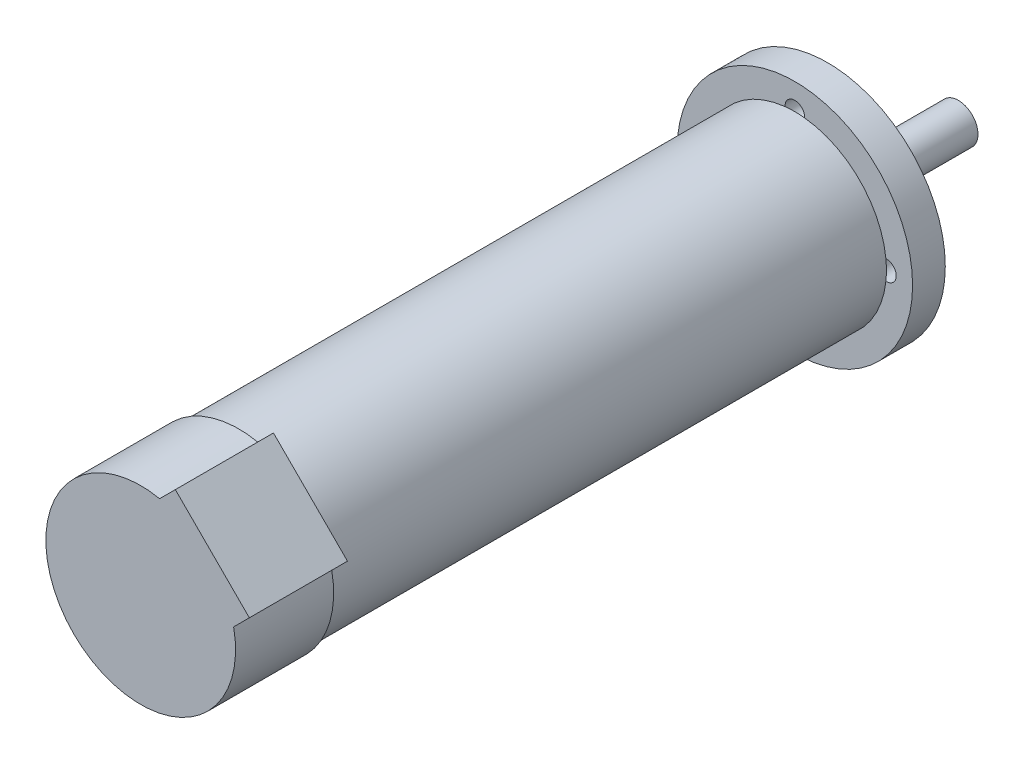
ISO-10303-21;
HEADER;
FILE_DESCRIPTION(('STEP AP214'),'2;1');
FILE_NAME('part.step','',(''),(''),'','','');
FILE_SCHEMA(('AUTOMOTIVE_DESIGN { 1 0 10303 214 1 1 1 1 }'));
ENDSEC;
DATA;
#1=APPLICATION_CONTEXT('core data for automotive mechanical design processes');
#2=APPLICATION_PROTOCOL_DEFINITION('international standard','automotive_design',2000,#1);
#3=PRODUCT_CONTEXT('',#1,'mechanical');
#4=PRODUCT('Part','Part','',(#3));
#5=PRODUCT_RELATED_PRODUCT_CATEGORY('part','',(#4));
#6=PRODUCT_DEFINITION_FORMATION('','',#4);
#7=PRODUCT_DEFINITION_CONTEXT('part definition',#1,'design');
#8=PRODUCT_DEFINITION('design','',#6,#7);
#9=PRODUCT_DEFINITION_SHAPE('','',#8);
#10=(LENGTH_UNIT() NAMED_UNIT(*) SI_UNIT(.MILLI.,.METRE.));
#11=(NAMED_UNIT(*) PLANE_ANGLE_UNIT() SI_UNIT($,.RADIAN.));
#12=(NAMED_UNIT(*) SI_UNIT($,.STERADIAN.) SOLID_ANGLE_UNIT());
#13=UNCERTAINTY_MEASURE_WITH_UNIT(LENGTH_MEASURE(1.E-05),#10,'distance_accuracy_value','');
#14=(GEOMETRIC_REPRESENTATION_CONTEXT(3) GLOBAL_UNCERTAINTY_ASSIGNED_CONTEXT((#13)) GLOBAL_UNIT_ASSIGNED_CONTEXT((#10,
#11,#12)) REPRESENTATION_CONTEXT('',''));
#15=CARTESIAN_POINT('',(0.,0.,0.));
#16=DIRECTION('',(0.,0.,1.));
#17=DIRECTION('',(1.,0.,0.));
#18=AXIS2_PLACEMENT_3D('',#15,#16,#17);
#19=CARTESIAN_POINT('',(0.,0.,105.));
#20=DIRECTION('',(0.,0.,-1.));
#21=DIRECTION('',(-1.,0.,0.));
#22=AXIS2_PLACEMENT_3D('',#19,#20,#21);
#23=CYLINDRICAL_SURFACE('',#22,14.);
#24=CARTESIAN_POINT('',(0.,0.,5.));
#25=DIRECTION('',(0.,0.,1.));
#26=DIRECTION('',(1.,0.,0.));
#27=AXIS2_PLACEMENT_3D('',#24,#25,#26);
#28=CIRCLE('',#27,14.);
#29=CARTESIAN_POINT('',(1.4978460300017,13.9196428571429,5.));
#30=VERTEX_POINT('',#29);
#31=CARTESIAN_POINT('',(-1.4978460300017,13.9196428571429,5.));
#32=VERTEX_POINT('',#31);
#33=EDGE_CURVE('E122',#30,#32,#28,.T.);
#34=ORIENTED_EDGE('',*,*,#33,.T.);
#35=CARTESIAN_POINT('',(-13.9196428571429,1.4978460300017,5.));
#36=VERTEX_POINT('',#35);
#37=EDGE_CURVE('E130',#32,#36,#28,.T.);
#38=ORIENTED_EDGE('',*,*,#37,.T.);
#39=CARTESIAN_POINT('',(-13.9196428571429,-1.49784603000169,5.));
#40=VERTEX_POINT('',#39);
#41=EDGE_CURVE('E294',#36,#40,#28,.T.);
#42=ORIENTED_EDGE('',*,*,#41,.T.);
#43=CARTESIAN_POINT('',(-1.4978460300017,-13.9196428571429,5.));
#44=VERTEX_POINT('',#43);
#45=EDGE_CURVE('E290',#40,#44,#28,.T.);
#46=ORIENTED_EDGE('',*,*,#45,.T.);
#47=CARTESIAN_POINT('',(1.49784603000169,-13.9196428571429,5.));
#48=VERTEX_POINT('',#47);
#49=EDGE_CURVE('E126',#44,#48,#28,.T.);
#50=ORIENTED_EDGE('',*,*,#49,.T.);
#51=CARTESIAN_POINT('',(13.9196428571429,-1.4978460300017,5.));
#52=VERTEX_POINT('',#51);
#53=EDGE_CURVE('E125',#48,#52,#28,.T.);
#54=ORIENTED_EDGE('',*,*,#53,.T.);
#55=CARTESIAN_POINT('',(13.9196428571429,1.49784603000169,5.));
#56=VERTEX_POINT('',#55);
#57=EDGE_CURVE('E108',#52,#56,#28,.T.);
#58=ORIENTED_EDGE('',*,*,#57,.T.);
#59=EDGE_CURVE('E111',#56,#30,#28,.T.);
#60=ORIENTED_EDGE('',*,*,#59,.T.);
#61=EDGE_LOOP('',(#34,#38,#42,#46,#50,#54,#58,#60));
#62=FACE_BOUND('',#61,.T.);
#63=CARTESIAN_POINT('',(0.,0.,90.));
#64=DIRECTION('',(0.,0.,1.));
#65=DIRECTION('',(1.,0.,0.));
#66=AXIS2_PLACEMENT_3D('',#63,#64,#65);
#67=CIRCLE('',#66,14.);
#68=CARTESIAN_POINT('',(14.,0.,90.));
#69=VERTEX_POINT('',#68);
#70=EDGE_CURVE('E42',#69,#69,#67,.T.);
#71=ORIENTED_EDGE('',*,*,#70,.F.);
#72=EDGE_LOOP('',(#71));
#73=FACE_BOUND('',#72,.T.);
#74=ADVANCED_FACE('F34',(#62,#73),#23,.T.);
#75=CARTESIAN_POINT('',(0.,0.,5.));
#76=DIRECTION('',(0.,0.,-1.));
#77=DIRECTION('',(-1.,0.,0.));
#78=AXIS2_PLACEMENT_3D('',#75,#76,#77);
#79=CYLINDRICAL_SURFACE('',#78,18.);
#80=CARTESIAN_POINT('',(0.,0.,5.));
#81=DIRECTION('',(0.,0.,1.));
#82=DIRECTION('',(1.,0.,0.));
#83=AXIS2_PLACEMENT_3D('',#80,#81,#82);
#84=CIRCLE('',#83,18.);
#85=CARTESIAN_POINT('',(18.,0.,5.));
#86=VERTEX_POINT('',#85);
#87=EDGE_CURVE('E133',#86,#86,#84,.T.);
#88=ORIENTED_EDGE('',*,*,#87,.F.);
#89=EDGE_LOOP('',(#88));
#90=FACE_BOUND('',#89,.T.);
#91=CARTESIAN_POINT('',(0.,0.,0.));
#92=DIRECTION('',(0.,0.,1.));
#93=DIRECTION('',(1.,0.,0.));
#94=AXIS2_PLACEMENT_3D('',#91,#92,#93);
#95=CIRCLE('',#94,18.);
#96=CARTESIAN_POINT('',(18.,0.,0.));
#97=VERTEX_POINT('',#96);
#98=EDGE_CURVE('E129',#97,#97,#95,.T.);
#99=ORIENTED_EDGE('',*,*,#98,.T.);
#100=EDGE_LOOP('',(#99));
#101=FACE_BOUND('',#100,.T.);
#102=ADVANCED_FACE('F36',(#90,#101),#79,.T.);
#103=CARTESIAN_POINT('',(0.,0.,5.));
#104=DIRECTION('',(0.,0.,1.));
#105=DIRECTION('',(1.,0.,0.));
#106=AXIS2_PLACEMENT_3D('',#103,#104,#105);
#107=PLANE('',#106);
#108=CARTESIAN_POINT('',(-14.,0.,5.));
#109=DIRECTION('',(0.,0.,1.));
#110=DIRECTION('',(1.,0.,0.));
#111=AXIS2_PLACEMENT_3D('',#108,#109,#110);
#112=CIRCLE('',#111,1.5);
#113=EDGE_CURVE('E181',#40,#36,#112,.F.);
#114=ORIENTED_EDGE('',*,*,#113,.T.);
#115=ORIENTED_EDGE('',*,*,#37,.F.);
#116=CARTESIAN_POINT('',(0.,14.,5.));
#117=DIRECTION('',(0.,0.,1.));
#118=DIRECTION('',(1.,0.,0.));
#119=AXIS2_PLACEMENT_3D('',#116,#117,#118);
#120=CIRCLE('',#119,1.5);
#121=EDGE_CURVE('E116',#32,#30,#120,.F.);
#122=ORIENTED_EDGE('',*,*,#121,.T.);
#123=ORIENTED_EDGE('',*,*,#59,.F.);
#124=CARTESIAN_POINT('',(14.,0.,5.));
#125=DIRECTION('',(0.,0.,1.));
#126=DIRECTION('',(1.,0.,0.));
#127=AXIS2_PLACEMENT_3D('',#124,#125,#126);
#128=CIRCLE('',#127,1.5);
#129=EDGE_CURVE('E97',#56,#52,#128,.F.);
#130=ORIENTED_EDGE('',*,*,#129,.T.);
#131=ORIENTED_EDGE('',*,*,#53,.F.);
#132=CARTESIAN_POINT('',(0.,-14.,5.));
#133=DIRECTION('',(0.,0.,1.));
#134=DIRECTION('',(1.,0.,0.));
#135=AXIS2_PLACEMENT_3D('',#132,#133,#134);
#136=CIRCLE('',#135,1.5);
#137=EDGE_CURVE('E286',#48,#44,#136,.F.);
#138=ORIENTED_EDGE('',*,*,#137,.T.);
#139=ORIENTED_EDGE('',*,*,#45,.F.);
#140=EDGE_LOOP('',(#114,#115,#122,#123,#130,#131,#138,#139));
#141=FACE_BOUND('',#140,.T.);
#142=ORIENTED_EDGE('',*,*,#87,.T.);
#143=EDGE_LOOP('',(#142));
#144=FACE_BOUND('',#143,.T.);
#145=ADVANCED_FACE('F113',(#141,#144),#107,.T.);
#146=CARTESIAN_POINT('',(0.,0.,0.));
#147=DIRECTION('',(0.,0.,1.));
#148=DIRECTION('',(1.,0.,0.));
#149=AXIS2_PLACEMENT_3D('',#146,#147,#148);
#150=PLANE('',#149);
#151=CARTESIAN_POINT('',(0.,0.,0.));
#152=DIRECTION('',(0.,0.,1.));
#153=DIRECTION('',(1.,0.,0.));
#154=AXIS2_PLACEMENT_3D('',#151,#152,#153);
#155=CIRCLE('',#154,3.);
#156=CARTESIAN_POINT('',(3.,0.,0.));
#157=VERTEX_POINT('',#156);
#158=EDGE_CURVE('E11',#157,#157,#155,.F.);
#159=ORIENTED_EDGE('',*,*,#158,.F.);
#160=EDGE_LOOP('',(#159));
#161=FACE_BOUND('',#160,.T.);
#162=CARTESIAN_POINT('',(-14.,0.,0.));
#163=DIRECTION('',(0.,0.,-1.));
#164=DIRECTION('',(-1.,0.,0.));
#165=AXIS2_PLACEMENT_3D('',#162,#163,#164);
#166=CIRCLE('',#165,1.5);
#167=CARTESIAN_POINT('',(-15.5,0.,0.));
#168=VERTEX_POINT('',#167);
#169=EDGE_CURVE('E167',#168,#168,#166,.T.);
#170=ORIENTED_EDGE('',*,*,#169,.F.);
#171=EDGE_LOOP('',(#170));
#172=FACE_BOUND('',#171,.T.);
#173=CARTESIAN_POINT('',(0.,-14.,0.));
#174=DIRECTION('',(0.,0.,-1.));
#175=DIRECTION('',(-1.,0.,0.));
#176=AXIS2_PLACEMENT_3D('',#173,#174,#175);
#177=CIRCLE('',#176,1.5);
#178=CARTESIAN_POINT('',(-1.5,-14.,0.));
#179=VERTEX_POINT('',#178);
#180=EDGE_CURVE('E109',#179,#179,#177,.T.);
#181=ORIENTED_EDGE('',*,*,#180,.F.);
#182=EDGE_LOOP('',(#181));
#183=FACE_BOUND('',#182,.T.);
#184=CARTESIAN_POINT('',(14.,0.,0.));
#185=DIRECTION('',(0.,0.,-1.));
#186=DIRECTION('',(-1.,0.,0.));
#187=AXIS2_PLACEMENT_3D('',#184,#185,#186);
#188=CIRCLE('',#187,1.5);
#189=CARTESIAN_POINT('',(12.5,0.,0.));
#190=VERTEX_POINT('',#189);
#191=EDGE_CURVE('E103',#190,#190,#188,.T.);
#192=ORIENTED_EDGE('',*,*,#191,.F.);
#193=EDGE_LOOP('',(#192));
#194=FACE_BOUND('',#193,.T.);
#195=CARTESIAN_POINT('',(0.,14.,0.));
#196=DIRECTION('',(0.,0.,-1.));
#197=DIRECTION('',(-1.,0.,0.));
#198=AXIS2_PLACEMENT_3D('',#195,#196,#197);
#199=CIRCLE('',#198,1.5);
#200=CARTESIAN_POINT('',(-1.5,14.,0.));
#201=VERTEX_POINT('',#200);
#202=EDGE_CURVE('E177',#201,#201,#199,.T.);
#203=ORIENTED_EDGE('',*,*,#202,.F.);
#204=EDGE_LOOP('',(#203));
#205=FACE_BOUND('',#204,.T.);
#206=ORIENTED_EDGE('',*,*,#98,.F.);
#207=EDGE_LOOP('',(#206));
#208=FACE_BOUND('',#207,.T.);
#209=ADVANCED_FACE('F153',(#161,#172,#183,#194,#205,#208),#150,.F.);
#210=CARTESIAN_POINT('',(16.6093197788745,5.29561127988977,90.));
#211=DIRECTION('',(0.707106781186548,-0.707106781186547,0.));
#212=DIRECTION('',(0.707106781186547,0.707106781186548,0.));
#213=AXIS2_PLACEMENT_3D('',#210,#211,#212);
#214=PLANE('',#213);
#215=DIRECTION('',(0.707106781186547,0.707106781186548,0.));
#216=VECTOR('',#215,1.);
#217=CARTESIAN_POINT('',(16.6093197788745,5.29561127988977,105.));
#218=LINE('',#217,#216);
#219=CARTESIAN_POINT('',(14.2081699377359,2.89446143875114,105.));
#220=VERTEX_POINT('',#219);
#221=CARTESIAN_POINT('',(16.6093197788745,5.29561127988977,105.));
#222=VERTEX_POINT('',#221);
#223=EDGE_CURVE('E190',#220,#222,#218,.T.);
#224=ORIENTED_EDGE('',*,*,#223,.F.);
#225=DIRECTION('',(0.,0.,1.));
#226=VECTOR('',#225,1.);
#227=CARTESIAN_POINT('',(14.2081699377359,2.89446143875114,90.));
#228=LINE('',#227,#226);
#229=CARTESIAN_POINT('',(14.2081699377359,2.89446143875114,90.));
#230=VERTEX_POINT('',#229);
#231=EDGE_CURVE('E120',#230,#220,#228,.T.);
#232=ORIENTED_EDGE('',*,*,#231,.F.);
#233=DIRECTION('',(0.707106781186547,0.707106781186548,0.));
#234=VECTOR('',#233,1.);
#235=CARTESIAN_POINT('',(16.6093197788745,5.29561127988977,90.));
#236=LINE('',#235,#234);
#237=CARTESIAN_POINT('',(16.6093197788745,5.29561127988977,90.));
#238=VERTEX_POINT('',#237);
#239=EDGE_CURVE('E191',#230,#238,#236,.T.);
#240=ORIENTED_EDGE('',*,*,#239,.T.);
#241=DIRECTION('',(0.,0.,1.));
#242=VECTOR('',#241,1.);
#243=CARTESIAN_POINT('',(16.6093197788745,5.29561127988977,90.));
#244=LINE('',#243,#242);
#245=EDGE_CURVE('E131',#238,#222,#244,.T.);
#246=ORIENTED_EDGE('',*,*,#245,.T.);
#247=EDGE_LOOP('',(#224,#232,#240,#246));
#248=FACE_BOUND('',#247,.T.);
#249=ADVANCED_FACE('F155',(#248),#214,.T.);
#250=CARTESIAN_POINT('',(0.,0.,90.));
#251=DIRECTION('',(0.,0.,1.));
#252=DIRECTION('',(1.,0.,0.));
#253=AXIS2_PLACEMENT_3D('',#250,#251,#252);
#254=CYLINDRICAL_SURFACE('',#253,14.5);
#255=CARTESIAN_POINT('',(0.,0.,105.));
#256=DIRECTION('',(0.,0.,1.));
#257=DIRECTION('',(1.,0.,0.));
#258=AXIS2_PLACEMENT_3D('',#255,#256,#257);
#259=CIRCLE('',#258,14.5);
#260=CARTESIAN_POINT('',(2.89446143875117,14.2081699377359,105.));
#261=VERTEX_POINT('',#260);
#262=EDGE_CURVE('E195',#261,#220,#259,.T.);
#263=ORIENTED_EDGE('',*,*,#262,.F.);
#264=DIRECTION('',(0.,0.,1.));
#265=VECTOR('',#264,1.);
#266=CARTESIAN_POINT('',(2.89446143875117,14.2081699377359,90.));
#267=LINE('',#266,#265);
#268=CARTESIAN_POINT('',(2.89446143875117,14.2081699377359,90.));
#269=VERTEX_POINT('',#268);
#270=EDGE_CURVE('E215',#269,#261,#267,.T.);
#271=ORIENTED_EDGE('',*,*,#270,.F.);
#272=CARTESIAN_POINT('',(0.,0.,90.));
#273=DIRECTION('',(0.,0.,1.));
#274=DIRECTION('',(1.,0.,0.));
#275=AXIS2_PLACEMENT_3D('',#272,#273,#274);
#276=CIRCLE('',#275,14.5);
#277=EDGE_CURVE('E201',#269,#230,#276,.T.);
#278=ORIENTED_EDGE('',*,*,#277,.T.);
#279=ORIENTED_EDGE('',*,*,#231,.T.);
#280=EDGE_LOOP('',(#263,#271,#278,#279));
#281=FACE_BOUND('',#280,.T.);
#282=ADVANCED_FACE('F160',(#281),#254,.T.);
#283=CARTESIAN_POINT('',(5.29561127988979,16.6093197788745,90.));
#284=DIRECTION('',(-0.707106781186547,0.707106781186548,0.));
#285=DIRECTION('',(-0.707106781186548,-0.707106781186547,0.));
#286=AXIS2_PLACEMENT_3D('',#283,#284,#285);
#287=PLANE('',#286);
#288=DIRECTION('',(-0.707106781186548,-0.707106781186547,0.));
#289=VECTOR('',#288,1.);
#290=CARTESIAN_POINT('',(5.29561127988979,16.6093197788745,105.));
#291=LINE('',#290,#289);
#292=CARTESIAN_POINT('',(5.29561127988979,16.6093197788745,105.));
#293=VERTEX_POINT('',#292);
#294=EDGE_CURVE('E209',#293,#261,#291,.T.);
#295=ORIENTED_EDGE('',*,*,#294,.F.);
#296=DIRECTION('',(0.,0.,1.));
#297=VECTOR('',#296,1.);
#298=CARTESIAN_POINT('',(5.29561127988979,16.6093197788745,90.));
#299=LINE('',#298,#297);
#300=CARTESIAN_POINT('',(5.29561127988979,16.6093197788745,90.));
#301=VERTEX_POINT('',#300);
#302=EDGE_CURVE('E216',#301,#293,#299,.T.);
#303=ORIENTED_EDGE('',*,*,#302,.F.);
#304=DIRECTION('',(-0.707106781186548,-0.707106781186547,0.));
#305=VECTOR('',#304,1.);
#306=CARTESIAN_POINT('',(5.29561127988979,16.6093197788745,90.));
#307=LINE('',#306,#305);
#308=EDGE_CURVE('E198',#301,#269,#307,.T.);
#309=ORIENTED_EDGE('',*,*,#308,.T.);
#310=ORIENTED_EDGE('',*,*,#270,.T.);
#311=EDGE_LOOP('',(#295,#303,#309,#310));
#312=FACE_BOUND('',#311,.T.);
#313=ADVANCED_FACE('F230',(#312),#287,.T.);
#314=CARTESIAN_POINT('',(16.6093197788745,5.29561127988977,90.));
#315=DIRECTION('',(0.707106781186547,0.707106781186548,0.));
#316=DIRECTION('',(-0.707106781186548,0.707106781186547,0.));
#317=AXIS2_PLACEMENT_3D('',#314,#315,#316);
#318=PLANE('',#317);
#319=DIRECTION('',(-0.707106781186548,0.707106781186547,0.));
#320=VECTOR('',#319,1.);
#321=CARTESIAN_POINT('',(16.6093197788745,5.29561127988977,105.));
#322=LINE('',#321,#320);
#323=EDGE_CURVE('E206',#222,#293,#322,.T.);
#324=ORIENTED_EDGE('',*,*,#323,.F.);
#325=ORIENTED_EDGE('',*,*,#245,.F.);
#326=DIRECTION('',(-0.707106781186548,0.707106781186547,0.));
#327=VECTOR('',#326,1.);
#328=CARTESIAN_POINT('',(16.6093197788745,5.29561127988977,90.));
#329=LINE('',#328,#327);
#330=EDGE_CURVE('E194',#238,#301,#329,.T.);
#331=ORIENTED_EDGE('',*,*,#330,.T.);
#332=ORIENTED_EDGE('',*,*,#302,.T.);
#333=EDGE_LOOP('',(#324,#325,#331,#332));
#334=FACE_BOUND('',#333,.T.);
#335=ADVANCED_FACE('F223',(#334),#318,.T.);
#336=CARTESIAN_POINT('',(0.,0.,90.));
#337=DIRECTION('',(0.,0.,1.));
#338=DIRECTION('',(1.,0.,0.));
#339=AXIS2_PLACEMENT_3D('',#336,#337,#338);
#340=PLANE('',#339);
#341=ORIENTED_EDGE('',*,*,#70,.T.);
#342=EDGE_LOOP('',(#341));
#343=FACE_BOUND('',#342,.T.);
#344=ORIENTED_EDGE('',*,*,#239,.F.);
#345=ORIENTED_EDGE('',*,*,#277,.F.);
#346=ORIENTED_EDGE('',*,*,#308,.F.);
#347=ORIENTED_EDGE('',*,*,#330,.F.);
#348=EDGE_LOOP('',(#344,#345,#346,#347));
#349=FACE_BOUND('',#348,.T.);
#350=ADVANCED_FACE('F140',(#343,#349),#340,.F.);
#351=CARTESIAN_POINT('',(0.,0.,105.));
#352=DIRECTION('',(0.,0.,1.));
#353=DIRECTION('',(1.,0.,0.));
#354=AXIS2_PLACEMENT_3D('',#351,#352,#353);
#355=PLANE('',#354);
#356=ORIENTED_EDGE('',*,*,#223,.T.);
#357=ORIENTED_EDGE('',*,*,#323,.T.);
#358=ORIENTED_EDGE('',*,*,#294,.T.);
#359=ORIENTED_EDGE('',*,*,#262,.T.);
#360=EDGE_LOOP('',(#356,#357,#358,#359));
#361=FACE_BOUND('',#360,.T.);
#362=ADVANCED_FACE('F150',(#361),#355,.T.);
#363=CARTESIAN_POINT('',(0.,0.,5.));
#364=DIRECTION('',(0.,0.,1.));
#365=DIRECTION('',(1.,0.,0.));
#366=AXIS2_PLACEMENT_3D('',#363,#364,#365);
#367=PLANE('',#366);
#368=EDGE_CURVE('E183',#30,#32,#120,.F.);
#369=ORIENTED_EDGE('',*,*,#368,.T.);
#370=ORIENTED_EDGE('',*,*,#33,.F.);
#371=EDGE_LOOP('',(#369,#370));
#372=FACE_BOUND('',#371,.T.);
#373=ADVANCED_FACE('F242',(#372),#367,.F.);
#374=CARTESIAN_POINT('',(0.,14.,9.24264068711929));
#375=DIRECTION('',(0.,0.,-1.));
#376=DIRECTION('',(-1.,0.,0.));
#377=AXIS2_PLACEMENT_3D('',#374,#375,#376);
#378=CYLINDRICAL_SURFACE('',#377,1.5);
#379=ORIENTED_EDGE('',*,*,#202,.T.);
#380=EDGE_LOOP('',(#379));
#381=FACE_BOUND('',#380,.T.);
#382=ORIENTED_EDGE('',*,*,#368,.F.);
#383=ORIENTED_EDGE('',*,*,#121,.F.);
#384=EDGE_LOOP('',(#382,#383));
#385=FACE_BOUND('',#384,.T.);
#386=ADVANCED_FACE('F245',(#381,#385),#378,.F.);
#387=CARTESIAN_POINT('',(0.,0.,5.));
#388=DIRECTION('',(0.,0.,1.));
#389=DIRECTION('',(1.,0.,0.));
#390=AXIS2_PLACEMENT_3D('',#387,#388,#389);
#391=PLANE('',#390);
#392=EDGE_CURVE('E48',#52,#56,#128,.F.);
#393=ORIENTED_EDGE('',*,*,#392,.T.);
#394=ORIENTED_EDGE('',*,*,#57,.F.);
#395=EDGE_LOOP('',(#393,#394));
#396=FACE_BOUND('',#395,.T.);
#397=ADVANCED_FACE('F106',(#396),#391,.F.);
#398=CARTESIAN_POINT('',(14.,0.,9.24264068711929));
#399=DIRECTION('',(0.,0.,-1.));
#400=DIRECTION('',(-1.,0.,0.));
#401=AXIS2_PLACEMENT_3D('',#398,#399,#400);
#402=CYLINDRICAL_SURFACE('',#401,1.5);
#403=ORIENTED_EDGE('',*,*,#191,.T.);
#404=EDGE_LOOP('',(#403));
#405=FACE_BOUND('',#404,.T.);
#406=ORIENTED_EDGE('',*,*,#392,.F.);
#407=ORIENTED_EDGE('',*,*,#129,.F.);
#408=EDGE_LOOP('',(#406,#407));
#409=FACE_BOUND('',#408,.T.);
#410=ADVANCED_FACE('F98',(#405,#409),#402,.F.);
#411=CARTESIAN_POINT('',(0.,0.,5.));
#412=DIRECTION('',(0.,0.,1.));
#413=DIRECTION('',(1.,0.,0.));
#414=AXIS2_PLACEMENT_3D('',#411,#412,#413);
#415=PLANE('',#414);
#416=EDGE_CURVE('E55',#44,#48,#136,.F.);
#417=ORIENTED_EDGE('',*,*,#416,.T.);
#418=ORIENTED_EDGE('',*,*,#49,.F.);
#419=EDGE_LOOP('',(#417,#418));
#420=FACE_BOUND('',#419,.T.);
#421=ADVANCED_FACE('F253',(#420),#415,.F.);
#422=CARTESIAN_POINT('',(0.,-14.,9.24264068711929));
#423=DIRECTION('',(0.,0.,-1.));
#424=DIRECTION('',(-1.,0.,0.));
#425=AXIS2_PLACEMENT_3D('',#422,#423,#424);
#426=CYLINDRICAL_SURFACE('',#425,1.5);
#427=ORIENTED_EDGE('',*,*,#180,.T.);
#428=EDGE_LOOP('',(#427));
#429=FACE_BOUND('',#428,.T.);
#430=ORIENTED_EDGE('',*,*,#416,.F.);
#431=ORIENTED_EDGE('',*,*,#137,.F.);
#432=EDGE_LOOP('',(#430,#431));
#433=FACE_BOUND('',#432,.T.);
#434=ADVANCED_FACE('F257',(#429,#433),#426,.F.);
#435=CARTESIAN_POINT('',(0.,0.,5.));
#436=DIRECTION('',(0.,0.,1.));
#437=DIRECTION('',(1.,0.,0.));
#438=AXIS2_PLACEMENT_3D('',#435,#436,#437);
#439=PLANE('',#438);
#440=EDGE_CURVE('E185',#36,#40,#112,.F.);
#441=ORIENTED_EDGE('',*,*,#440,.T.);
#442=ORIENTED_EDGE('',*,*,#41,.F.);
#443=EDGE_LOOP('',(#441,#442));
#444=FACE_BOUND('',#443,.T.);
#445=ADVANCED_FACE('F261',(#444),#439,.F.);
#446=CARTESIAN_POINT('',(-14.,0.,9.24264068711929));
#447=DIRECTION('',(0.,0.,-1.));
#448=DIRECTION('',(-1.,0.,0.));
#449=AXIS2_PLACEMENT_3D('',#446,#447,#448);
#450=CYLINDRICAL_SURFACE('',#449,1.5);
#451=ORIENTED_EDGE('',*,*,#169,.T.);
#452=EDGE_LOOP('',(#451));
#453=FACE_BOUND('',#452,.T.);
#454=ORIENTED_EDGE('',*,*,#113,.F.);
#455=ORIENTED_EDGE('',*,*,#440,.F.);
#456=EDGE_LOOP('',(#454,#455));
#457=FACE_BOUND('',#456,.T.);
#458=ADVANCED_FACE('F265',(#453,#457),#450,.F.);
#459=CARTESIAN_POINT('',(0.,0.,-20.));
#460=DIRECTION('',(0.,0.,1.));
#461=DIRECTION('',(1.,0.,0.));
#462=AXIS2_PLACEMENT_3D('',#459,#460,#461);
#463=CYLINDRICAL_SURFACE('',#462,3.);
#464=CARTESIAN_POINT('',(0.,0.,-20.));
#465=DIRECTION('',(0.,0.,-1.));
#466=DIRECTION('',(-1.,0.,0.));
#467=AXIS2_PLACEMENT_3D('',#464,#465,#466);
#468=CIRCLE('',#467,3.);
#469=CARTESIAN_POINT('',(-3.,0.,-20.));
#470=VERTEX_POINT('',#469);
#471=EDGE_CURVE('E281',#470,#470,#468,.T.);
#472=ORIENTED_EDGE('',*,*,#471,.F.);
#473=EDGE_LOOP('',(#472));
#474=FACE_BOUND('',#473,.T.);
#475=ORIENTED_EDGE('',*,*,#158,.T.);
#476=EDGE_LOOP('',(#475));
#477=FACE_BOUND('',#476,.T.);
#478=ADVANCED_FACE('F269',(#474,#477),#463,.T.);
#479=CARTESIAN_POINT('',(0.,0.,-20.));
#480=DIRECTION('',(0.,0.,-1.));
#481=DIRECTION('',(-1.,0.,0.));
#482=AXIS2_PLACEMENT_3D('',#479,#480,#481);
#483=PLANE('',#482);
#484=ORIENTED_EDGE('',*,*,#471,.T.);
#485=EDGE_LOOP('',(#484));
#486=FACE_BOUND('',#485,.T.);
#487=ADVANCED_FACE('F273',(#486),#483,.T.);
#488=CLOSED_SHELL('',(#74,#102,#145,#209,#249,#282,#313,#335,#350,#362,#373,#386,#397,#410,#421,
#434,#445,#458,#478,#487));
#489=MANIFOLD_SOLID_BREP('B2',#488);
#490=ADVANCED_BREP_SHAPE_REPRESENTATION('',(#18,#489),#14);
#491=SHAPE_DEFINITION_REPRESENTATION(#9,#490);
ENDSEC;
END-ISO-10303-21;
